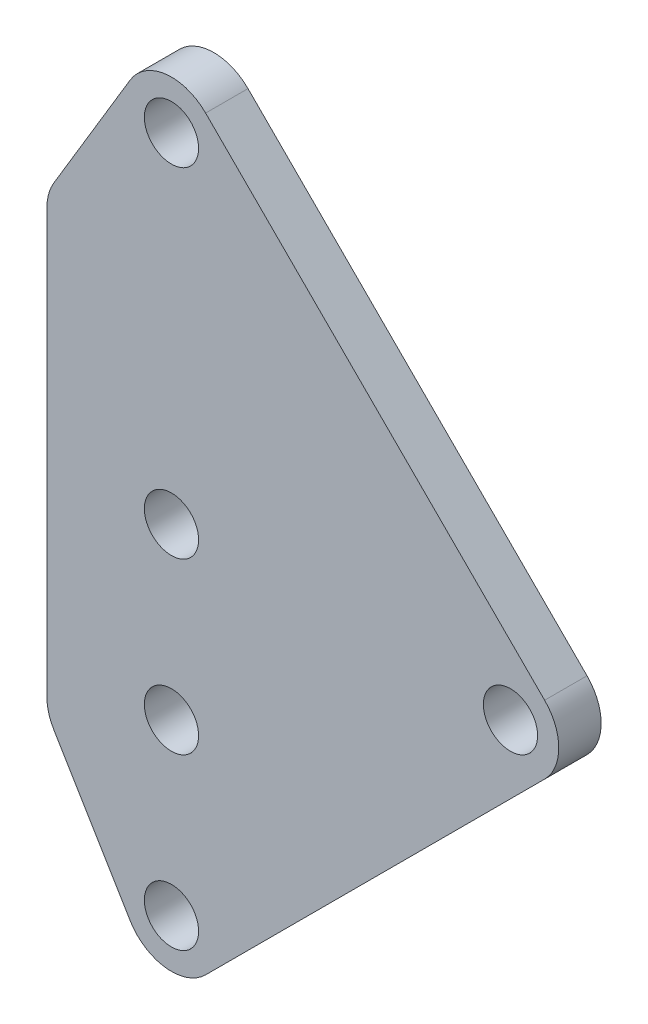
ISO-10303-21;
HEADER;
FILE_DESCRIPTION(('STEP AP214'),'2;1');
FILE_NAME('part.step','',(''),(''),'','','');
FILE_SCHEMA(('AUTOMOTIVE_DESIGN { 1 0 10303 214 1 1 1 1 }'));
ENDSEC;
DATA;
#1=APPLICATION_CONTEXT('core data for automotive mechanical design processes');
#2=APPLICATION_PROTOCOL_DEFINITION('international standard','automotive_design',2000,#1);
#3=PRODUCT_CONTEXT('',#1,'mechanical');
#4=PRODUCT('Part','Part','',(#3));
#5=PRODUCT_RELATED_PRODUCT_CATEGORY('part','',(#4));
#6=PRODUCT_DEFINITION_FORMATION('','',#4);
#7=PRODUCT_DEFINITION_CONTEXT('part definition',#1,'design');
#8=PRODUCT_DEFINITION('design','',#6,#7);
#9=PRODUCT_DEFINITION_SHAPE('','',#8);
#10=(LENGTH_UNIT() NAMED_UNIT(*) SI_UNIT(.MILLI.,.METRE.));
#11=(NAMED_UNIT(*) PLANE_ANGLE_UNIT() SI_UNIT($,.RADIAN.));
#12=(NAMED_UNIT(*) SI_UNIT($,.STERADIAN.) SOLID_ANGLE_UNIT());
#13=UNCERTAINTY_MEASURE_WITH_UNIT(LENGTH_MEASURE(1.E-05),#10,'distance_accuracy_value','');
#14=(GEOMETRIC_REPRESENTATION_CONTEXT(3) GLOBAL_UNCERTAINTY_ASSIGNED_CONTEXT((#13)) GLOBAL_UNIT_ASSIGNED_CONTEXT((#10,
#11,#12)) REPRESENTATION_CONTEXT('',''));
#15=CARTESIAN_POINT('',(0.,0.,0.));
#16=DIRECTION('',(0.,0.,1.));
#17=DIRECTION('',(1.,0.,0.));
#18=AXIS2_PLACEMENT_3D('',#15,#16,#17);
#19=CARTESIAN_POINT('',(0.,-25.4,3.175));
#20=DIRECTION('',(0.,0.,1.));
#21=DIRECTION('',(1.,0.,0.));
#22=AXIS2_PLACEMENT_3D('',#19,#20,#21);
#23=PLANE('',#22);
#24=CARTESIAN_POINT('',(25.4,0.,3.175));
#25=DIRECTION('',(0.,0.,1.));
#26=DIRECTION('',(1.,0.,0.));
#27=AXIS2_PLACEMENT_3D('',#24,#25,#26);
#28=CIRCLE('',#27,2.032);
#29=CARTESIAN_POINT('',(27.432,0.,3.175));
#30=VERTEX_POINT('',#29);
#31=EDGE_CURVE('E271',#30,#30,#28,.T.);
#32=ORIENTED_EDGE('',*,*,#31,.F.);
#33=EDGE_LOOP('',(#32));
#34=FACE_BOUND('',#33,.T.);
#35=CARTESIAN_POINT('',(0.,25.4,3.175));
#36=DIRECTION('',(0.,0.,1.));
#37=DIRECTION('',(1.,0.,0.));
#38=AXIS2_PLACEMENT_3D('',#35,#36,#37);
#39=CIRCLE('',#38,2.032);
#40=CARTESIAN_POINT('',(2.032,25.4,3.175));
#41=VERTEX_POINT('',#40);
#42=EDGE_CURVE('E255',#41,#41,#39,.T.);
#43=ORIENTED_EDGE('',*,*,#42,.F.);
#44=EDGE_LOOP('',(#43));
#45=FACE_BOUND('',#44,.T.);
#46=CARTESIAN_POINT('',(0.,-25.4,3.175));
#47=DIRECTION('',(0.,0.,1.));
#48=DIRECTION('',(1.,0.,0.));
#49=AXIS2_PLACEMENT_3D('',#46,#47,#48);
#50=CIRCLE('',#49,3.6195);
#51=CARTESIAN_POINT('',(-3.10419305845572,-27.2613881126287,3.175));
#52=VERTEX_POINT('',#51);
#53=CARTESIAN_POINT('',(2.55937299450471,-27.9593729945047,3.175));
#54=VERTEX_POINT('',#53);
#55=EDGE_CURVE('E188',#52,#54,#50,.T.);
#56=ORIENTED_EDGE('',*,*,#55,.T.);
#57=DIRECTION('',(0.707106781186547,0.707106781186547,0.));
#58=VECTOR('',#57,1.);
#59=CARTESIAN_POINT('',(2.55937299450471,-27.9593729945047,3.175));
#60=LINE('',#59,#58);
#61=CARTESIAN_POINT('',(27.9593729945047,-2.55937299450471,3.175));
#62=VERTEX_POINT('',#61);
#63=EDGE_CURVE('E112',#54,#62,#60,.T.);
#64=ORIENTED_EDGE('',*,*,#63,.T.);
#65=CARTESIAN_POINT('',(25.4,0.,3.175));
#66=DIRECTION('',(0.,0.,1.));
#67=DIRECTION('',(1.,0.,0.));
#68=AXIS2_PLACEMENT_3D('',#65,#66,#67);
#69=CIRCLE('',#68,3.6195);
#70=CARTESIAN_POINT('',(27.9593729945047,2.55937299450471,3.175));
#71=VERTEX_POINT('',#70);
#72=EDGE_CURVE('E217',#62,#71,#69,.T.);
#73=ORIENTED_EDGE('',*,*,#72,.T.);
#74=DIRECTION('',(-0.707106781186548,0.707106781186547,0.));
#75=VECTOR('',#74,1.);
#76=CARTESIAN_POINT('',(2.55937299450471,27.9593729945047,3.175));
#77=LINE('',#76,#75);
#78=CARTESIAN_POINT('',(2.55937299450471,27.9593729945047,3.175));
#79=VERTEX_POINT('',#78);
#80=EDGE_CURVE('E237',#71,#79,#77,.T.);
#81=ORIENTED_EDGE('',*,*,#80,.T.);
#82=CARTESIAN_POINT('',(0.,25.4,3.175));
#83=DIRECTION('',(0.,0.,1.));
#84=DIRECTION('',(1.,0.,0.));
#85=AXIS2_PLACEMENT_3D('',#82,#83,#84);
#86=CIRCLE('',#85,3.6195);
#87=CARTESIAN_POINT('',(-3.10419305845572,27.2613881126287,3.175));
#88=VERTEX_POINT('',#87);
#89=EDGE_CURVE('E233',#79,#88,#86,.T.);
#90=ORIENTED_EDGE('',*,*,#89,.T.);
#91=DIRECTION('',(-0.514266642527608,-0.857630351831943,0.));
#92=VECTOR('',#91,1.);
#93=CARTESIAN_POINT('',(-3.10419305845572,27.2613881126287,3.175));
#94=LINE('',#93,#92);
#95=CARTESIAN_POINT('',(-8.81573272074991,17.7363881126287,3.175));
#96=VERTEX_POINT('',#95);
#97=EDGE_CURVE('E236',#88,#96,#94,.T.);
#98=ORIENTED_EDGE('',*,*,#97,.T.);
#99=CARTESIAN_POINT('',(-5.71153966229419,15.875,3.175));
#100=DIRECTION('',(0.,0.,1.));
#101=DIRECTION('',(1.,0.,0.));
#102=AXIS2_PLACEMENT_3D('',#99,#100,#101);
#103=CIRCLE('',#102,3.6195);
#104=CARTESIAN_POINT('',(-9.33103966229419,15.875,3.175));
#105=VERTEX_POINT('',#104);
#106=EDGE_CURVE('E137',#96,#105,#103,.T.);
#107=ORIENTED_EDGE('',*,*,#106,.T.);
#108=DIRECTION('',(0.,-1.,0.));
#109=VECTOR('',#108,1.);
#110=CARTESIAN_POINT('',(-9.33103966229419,15.875,3.175));
#111=LINE('',#110,#109);
#112=CARTESIAN_POINT('',(-9.3310396622942,-15.875,3.175));
#113=VERTEX_POINT('',#112);
#114=EDGE_CURVE('E131',#105,#113,#111,.T.);
#115=ORIENTED_EDGE('',*,*,#114,.T.);
#116=CARTESIAN_POINT('',(-5.71153966229419,-15.875,3.175));
#117=DIRECTION('',(0.,0.,1.));
#118=DIRECTION('',(1.,0.,0.));
#119=AXIS2_PLACEMENT_3D('',#116,#117,#118);
#120=CIRCLE('',#119,3.6195);
#121=CARTESIAN_POINT('',(-8.81573272074991,-17.7363881126287,3.175));
#122=VERTEX_POINT('',#121);
#123=EDGE_CURVE('E135',#113,#122,#120,.T.);
#124=ORIENTED_EDGE('',*,*,#123,.T.);
#125=DIRECTION('',(0.514266642527608,-0.857630351831943,0.));
#126=VECTOR('',#125,1.);
#127=CARTESIAN_POINT('',(-3.10419305845572,-27.2613881126287,3.175));
#128=LINE('',#127,#126);
#129=EDGE_CURVE('E63',#122,#52,#128,.T.);
#130=ORIENTED_EDGE('',*,*,#129,.T.);
#131=EDGE_LOOP('',(#56,#64,#73,#81,#90,#98,#107,#115,#124,#130));
#132=FACE_BOUND('',#131,.T.);
#133=CARTESIAN_POINT('',(0.,0.,3.175));
#134=DIRECTION('',(0.,0.,1.));
#135=DIRECTION('',(1.,0.,0.));
#136=AXIS2_PLACEMENT_3D('',#133,#134,#135);
#137=CIRCLE('',#136,2.032);
#138=CARTESIAN_POINT('',(2.032,0.,3.175));
#139=VERTEX_POINT('',#138);
#140=EDGE_CURVE('E164',#139,#139,#137,.T.);
#141=ORIENTED_EDGE('',*,*,#140,.F.);
#142=EDGE_LOOP('',(#141));
#143=FACE_BOUND('',#142,.T.);
#144=CARTESIAN_POINT('',(0.,-25.4,3.175));
#145=DIRECTION('',(0.,0.,1.));
#146=DIRECTION('',(1.,0.,0.));
#147=AXIS2_PLACEMENT_3D('',#144,#145,#146);
#148=CIRCLE('',#147,2.032);
#149=CARTESIAN_POINT('',(2.032,-25.4,3.175));
#150=VERTEX_POINT('',#149);
#151=EDGE_CURVE('E263',#150,#150,#148,.T.);
#152=ORIENTED_EDGE('',*,*,#151,.F.);
#153=EDGE_LOOP('',(#152));
#154=FACE_BOUND('',#153,.T.);
#155=CARTESIAN_POINT('',(0.,-12.7,3.175));
#156=DIRECTION('',(0.,0.,1.));
#157=DIRECTION('',(1.,0.,0.));
#158=AXIS2_PLACEMENT_3D('',#155,#156,#157);
#159=CIRCLE('',#158,2.032);
#160=CARTESIAN_POINT('',(2.032,-12.7,3.175));
#161=VERTEX_POINT('',#160);
#162=EDGE_CURVE('E279',#161,#161,#159,.T.);
#163=ORIENTED_EDGE('',*,*,#162,.F.);
#164=EDGE_LOOP('',(#163));
#165=FACE_BOUND('',#164,.T.);
#166=ADVANCED_FACE('F45',(#34,#45,#132,#143,#154,#165),#23,.T.);
#167=CARTESIAN_POINT('',(0.,-25.4,0.));
#168=DIRECTION('',(0.,0.,1.));
#169=DIRECTION('',(1.,0.,0.));
#170=AXIS2_PLACEMENT_3D('',#167,#168,#169);
#171=PLANE('',#170);
#172=CARTESIAN_POINT('',(0.,-25.4,0.));
#173=DIRECTION('',(0.,0.,1.));
#174=DIRECTION('',(1.,0.,0.));
#175=AXIS2_PLACEMENT_3D('',#172,#173,#174);
#176=CIRCLE('',#175,3.6195);
#177=CARTESIAN_POINT('',(-3.10419305845572,-27.2613881126287,0.));
#178=VERTEX_POINT('',#177);
#179=CARTESIAN_POINT('',(2.55937299450471,-27.9593729945047,0.));
#180=VERTEX_POINT('',#179);
#181=EDGE_CURVE('E159',#178,#180,#176,.T.);
#182=ORIENTED_EDGE('',*,*,#181,.F.);
#183=DIRECTION('',(0.514266642527608,-0.857630351831943,0.));
#184=VECTOR('',#183,1.);
#185=CARTESIAN_POINT('',(-3.10419305845572,-27.2613881126287,0.));
#186=LINE('',#185,#184);
#187=CARTESIAN_POINT('',(-8.81573272074991,-17.7363881126287,0.));
#188=VERTEX_POINT('',#187);
#189=EDGE_CURVE('E104',#188,#178,#186,.T.);
#190=ORIENTED_EDGE('',*,*,#189,.F.);
#191=CARTESIAN_POINT('',(-5.71153966229419,-15.875,0.));
#192=DIRECTION('',(0.,0.,1.));
#193=DIRECTION('',(1.,0.,0.));
#194=AXIS2_PLACEMENT_3D('',#191,#192,#193);
#195=CIRCLE('',#194,3.6195);
#196=CARTESIAN_POINT('',(-9.3310396622942,-15.875,0.));
#197=VERTEX_POINT('',#196);
#198=EDGE_CURVE('E98',#197,#188,#195,.T.);
#199=ORIENTED_EDGE('',*,*,#198,.F.);
#200=DIRECTION('',(0.,-1.,0.));
#201=VECTOR('',#200,1.);
#202=CARTESIAN_POINT('',(-9.33103966229419,15.875,0.));
#203=LINE('',#202,#201);
#204=CARTESIAN_POINT('',(-9.33103966229419,15.875,0.));
#205=VERTEX_POINT('',#204);
#206=EDGE_CURVE('E146',#205,#197,#203,.T.);
#207=ORIENTED_EDGE('',*,*,#206,.F.);
#208=CARTESIAN_POINT('',(-5.71153966229419,15.875,0.));
#209=DIRECTION('',(0.,0.,1.));
#210=DIRECTION('',(1.,0.,0.));
#211=AXIS2_PLACEMENT_3D('',#208,#209,#210);
#212=CIRCLE('',#211,3.6195);
#213=CARTESIAN_POINT('',(-8.81573272074991,17.7363881126287,0.));
#214=VERTEX_POINT('',#213);
#215=EDGE_CURVE('E179',#214,#205,#212,.T.);
#216=ORIENTED_EDGE('',*,*,#215,.F.);
#217=DIRECTION('',(-0.514266642527608,-0.857630351831943,0.));
#218=VECTOR('',#217,1.);
#219=CARTESIAN_POINT('',(-3.10419305845572,27.2613881126287,0.));
#220=LINE('',#219,#218);
#221=CARTESIAN_POINT('',(-3.10419305845572,27.2613881126287,0.));
#222=VERTEX_POINT('',#221);
#223=EDGE_CURVE('E176',#222,#214,#220,.T.);
#224=ORIENTED_EDGE('',*,*,#223,.F.);
#225=CARTESIAN_POINT('',(0.,25.4,0.));
#226=DIRECTION('',(0.,0.,1.));
#227=DIRECTION('',(1.,0.,0.));
#228=AXIS2_PLACEMENT_3D('',#225,#226,#227);
#229=CIRCLE('',#228,3.6195);
#230=CARTESIAN_POINT('',(2.55937299450471,27.9593729945047,0.));
#231=VERTEX_POINT('',#230);
#232=EDGE_CURVE('E173',#231,#222,#229,.T.);
#233=ORIENTED_EDGE('',*,*,#232,.F.);
#234=DIRECTION('',(-0.707106781186548,0.707106781186547,0.));
#235=VECTOR('',#234,1.);
#236=CARTESIAN_POINT('',(2.55937299450471,27.9593729945047,0.));
#237=LINE('',#236,#235);
#238=CARTESIAN_POINT('',(27.9593729945047,2.55937299450471,0.));
#239=VERTEX_POINT('',#238);
#240=EDGE_CURVE('E170',#239,#231,#237,.T.);
#241=ORIENTED_EDGE('',*,*,#240,.F.);
#242=CARTESIAN_POINT('',(25.4,0.,0.));
#243=DIRECTION('',(0.,0.,1.));
#244=DIRECTION('',(1.,0.,0.));
#245=AXIS2_PLACEMENT_3D('',#242,#243,#244);
#246=CIRCLE('',#245,3.6195);
#247=CARTESIAN_POINT('',(27.9593729945047,-2.55937299450471,0.));
#248=VERTEX_POINT('',#247);
#249=EDGE_CURVE('E167',#248,#239,#246,.T.);
#250=ORIENTED_EDGE('',*,*,#249,.F.);
#251=DIRECTION('',(0.707106781186547,0.707106781186547,0.));
#252=VECTOR('',#251,1.);
#253=CARTESIAN_POINT('',(2.55937299450471,-27.9593729945047,0.));
#254=LINE('',#253,#252);
#255=EDGE_CURVE('E163',#180,#248,#254,.T.);
#256=ORIENTED_EDGE('',*,*,#255,.F.);
#257=EDGE_LOOP('',(#182,#190,#199,#207,#216,#224,#233,#241,#250,#256));
#258=FACE_BOUND('',#257,.T.);
#259=CARTESIAN_POINT('',(0.,0.,0.));
#260=DIRECTION('',(0.,0.,1.));
#261=DIRECTION('',(1.,0.,0.));
#262=AXIS2_PLACEMENT_3D('',#259,#260,#261);
#263=CIRCLE('',#262,2.032);
#264=CARTESIAN_POINT('',(2.032,0.,0.));
#265=VERTEX_POINT('',#264);
#266=EDGE_CURVE('E251',#265,#265,#263,.T.);
#267=ORIENTED_EDGE('',*,*,#266,.T.);
#268=EDGE_LOOP('',(#267));
#269=FACE_BOUND('',#268,.T.);
#270=CARTESIAN_POINT('',(0.,25.4,0.));
#271=DIRECTION('',(0.,0.,1.));
#272=DIRECTION('',(1.,0.,0.));
#273=AXIS2_PLACEMENT_3D('',#270,#271,#272);
#274=CIRCLE('',#273,2.032);
#275=CARTESIAN_POINT('',(2.032,25.4,0.));
#276=VERTEX_POINT('',#275);
#277=EDGE_CURVE('E259',#276,#276,#274,.T.);
#278=ORIENTED_EDGE('',*,*,#277,.T.);
#279=EDGE_LOOP('',(#278));
#280=FACE_BOUND('',#279,.T.);
#281=CARTESIAN_POINT('',(0.,-25.4,0.));
#282=DIRECTION('',(0.,0.,1.));
#283=DIRECTION('',(1.,0.,0.));
#284=AXIS2_PLACEMENT_3D('',#281,#282,#283);
#285=CIRCLE('',#284,2.032);
#286=CARTESIAN_POINT('',(2.032,-25.4,0.));
#287=VERTEX_POINT('',#286);
#288=EDGE_CURVE('E267',#287,#287,#285,.T.);
#289=ORIENTED_EDGE('',*,*,#288,.T.);
#290=EDGE_LOOP('',(#289));
#291=FACE_BOUND('',#290,.T.);
#292=CARTESIAN_POINT('',(25.4,0.,0.));
#293=DIRECTION('',(0.,0.,1.));
#294=DIRECTION('',(1.,0.,0.));
#295=AXIS2_PLACEMENT_3D('',#292,#293,#294);
#296=CIRCLE('',#295,2.032);
#297=CARTESIAN_POINT('',(27.432,0.,0.));
#298=VERTEX_POINT('',#297);
#299=EDGE_CURVE('E275',#298,#298,#296,.T.);
#300=ORIENTED_EDGE('',*,*,#299,.T.);
#301=EDGE_LOOP('',(#300));
#302=FACE_BOUND('',#301,.T.);
#303=CARTESIAN_POINT('',(0.,-12.7,0.));
#304=DIRECTION('',(0.,0.,1.));
#305=DIRECTION('',(1.,0.,0.));
#306=AXIS2_PLACEMENT_3D('',#303,#304,#305);
#307=CIRCLE('',#306,2.032);
#308=CARTESIAN_POINT('',(2.032,-12.7,0.));
#309=VERTEX_POINT('',#308);
#310=EDGE_CURVE('E283',#309,#309,#307,.T.);
#311=ORIENTED_EDGE('',*,*,#310,.T.);
#312=EDGE_LOOP('',(#311));
#313=FACE_BOUND('',#312,.T.);
#314=ADVANCED_FACE('F221',(#258,#269,#280,#291,#302,#313),#171,.F.);
#315=CARTESIAN_POINT('',(0.,-25.4,3.175));
#316=DIRECTION('',(0.,0.,-1.));
#317=DIRECTION('',(-1.,0.,0.));
#318=AXIS2_PLACEMENT_3D('',#315,#316,#317);
#319=CYLINDRICAL_SURFACE('',#318,3.6195);
#320=ORIENTED_EDGE('',*,*,#181,.T.);
#321=DIRECTION('',(0.,0.,-1.));
#322=VECTOR('',#321,1.);
#323=CARTESIAN_POINT('',(2.55937299450471,-27.9593729945047,3.175));
#324=LINE('',#323,#322);
#325=EDGE_CURVE('E11',#54,#180,#324,.T.);
#326=ORIENTED_EDGE('',*,*,#325,.F.);
#327=ORIENTED_EDGE('',*,*,#55,.F.);
#328=DIRECTION('',(0.,0.,-1.));
#329=VECTOR('',#328,1.);
#330=CARTESIAN_POINT('',(-3.10419305845572,-27.2613881126287,3.175));
#331=LINE('',#330,#329);
#332=EDGE_CURVE('E155',#52,#178,#331,.T.);
#333=ORIENTED_EDGE('',*,*,#332,.T.);
#334=EDGE_LOOP('',(#320,#326,#327,#333));
#335=FACE_BOUND('',#334,.T.);
#336=ADVANCED_FACE('F47',(#335),#319,.T.);
#337=CARTESIAN_POINT('',(2.55937299450471,-27.9593729945047,3.175));
#338=DIRECTION('',(-0.707106781186548,0.707106781186548,0.));
#339=DIRECTION('',(-0.707106781186548,-0.707106781186548,0.));
#340=AXIS2_PLACEMENT_3D('',#337,#338,#339);
#341=PLANE('',#340);
#342=ORIENTED_EDGE('',*,*,#255,.T.);
#343=DIRECTION('',(0.,0.,-1.));
#344=VECTOR('',#343,1.);
#345=CARTESIAN_POINT('',(27.9593729945047,-2.55937299450471,3.175));
#346=LINE('',#345,#344);
#347=EDGE_CURVE('E55',#62,#248,#346,.T.);
#348=ORIENTED_EDGE('',*,*,#347,.F.);
#349=ORIENTED_EDGE('',*,*,#63,.F.);
#350=ORIENTED_EDGE('',*,*,#325,.T.);
#351=EDGE_LOOP('',(#342,#348,#349,#350));
#352=FACE_BOUND('',#351,.T.);
#353=ADVANCED_FACE('F327',(#352),#341,.F.);
#354=CARTESIAN_POINT('',(25.4,0.,3.175));
#355=DIRECTION('',(0.,0.,-1.));
#356=DIRECTION('',(-1.,0.,0.));
#357=AXIS2_PLACEMENT_3D('',#354,#355,#356);
#358=CYLINDRICAL_SURFACE('',#357,3.6195);
#359=ORIENTED_EDGE('',*,*,#249,.T.);
#360=DIRECTION('',(0.,0.,-1.));
#361=VECTOR('',#360,1.);
#362=CARTESIAN_POINT('',(27.9593729945047,2.55937299450471,3.175));
#363=LINE('',#362,#361);
#364=EDGE_CURVE('E207',#71,#239,#363,.T.);
#365=ORIENTED_EDGE('',*,*,#364,.F.);
#366=ORIENTED_EDGE('',*,*,#72,.F.);
#367=ORIENTED_EDGE('',*,*,#347,.T.);
#368=EDGE_LOOP('',(#359,#365,#366,#367));
#369=FACE_BOUND('',#368,.T.);
#370=ADVANCED_FACE('F215',(#369),#358,.T.);
#371=CARTESIAN_POINT('',(2.55937299450471,27.9593729945047,3.175));
#372=DIRECTION('',(-0.707106781186547,-0.707106781186548,0.));
#373=DIRECTION('',(0.707106781186548,-0.707106781186547,0.));
#374=AXIS2_PLACEMENT_3D('',#371,#372,#373);
#375=PLANE('',#374);
#376=ORIENTED_EDGE('',*,*,#240,.T.);
#377=DIRECTION('',(0.,0.,-1.));
#378=VECTOR('',#377,1.);
#379=CARTESIAN_POINT('',(2.55937299450471,27.9593729945047,3.175));
#380=LINE('',#379,#378);
#381=EDGE_CURVE('E203',#79,#231,#380,.T.);
#382=ORIENTED_EDGE('',*,*,#381,.F.);
#383=ORIENTED_EDGE('',*,*,#80,.F.);
#384=ORIENTED_EDGE('',*,*,#364,.T.);
#385=EDGE_LOOP('',(#376,#382,#383,#384));
#386=FACE_BOUND('',#385,.T.);
#387=ADVANCED_FACE('F227',(#386),#375,.F.);
#388=CARTESIAN_POINT('',(0.,25.4,3.175));
#389=DIRECTION('',(0.,0.,-1.));
#390=DIRECTION('',(-1.,0.,0.));
#391=AXIS2_PLACEMENT_3D('',#388,#389,#390);
#392=CYLINDRICAL_SURFACE('',#391,3.6195);
#393=ORIENTED_EDGE('',*,*,#232,.T.);
#394=DIRECTION('',(0.,0.,-1.));
#395=VECTOR('',#394,1.);
#396=CARTESIAN_POINT('',(-3.10419305845572,27.2613881126287,3.175));
#397=LINE('',#396,#395);
#398=EDGE_CURVE('E199',#88,#222,#397,.T.);
#399=ORIENTED_EDGE('',*,*,#398,.F.);
#400=ORIENTED_EDGE('',*,*,#89,.F.);
#401=ORIENTED_EDGE('',*,*,#381,.T.);
#402=EDGE_LOOP('',(#393,#399,#400,#401));
#403=FACE_BOUND('',#402,.T.);
#404=ADVANCED_FACE('F231',(#403),#392,.T.);
#405=CARTESIAN_POINT('',(-3.10419305845572,27.2613881126287,3.175));
#406=DIRECTION('',(0.857630351831942,-0.514266642527608,0.));
#407=DIRECTION('',(0.514266642527608,0.857630351831943,0.));
#408=AXIS2_PLACEMENT_3D('',#405,#406,#407);
#409=PLANE('',#408);
#410=ORIENTED_EDGE('',*,*,#223,.T.);
#411=DIRECTION('',(0.,0.,-1.));
#412=VECTOR('',#411,1.);
#413=CARTESIAN_POINT('',(-8.81573272074991,17.7363881126287,3.175));
#414=LINE('',#413,#412);
#415=EDGE_CURVE('E195',#96,#214,#414,.T.);
#416=ORIENTED_EDGE('',*,*,#415,.F.);
#417=ORIENTED_EDGE('',*,*,#97,.F.);
#418=ORIENTED_EDGE('',*,*,#398,.T.);
#419=EDGE_LOOP('',(#410,#416,#417,#418));
#420=FACE_BOUND('',#419,.T.);
#421=ADVANCED_FACE('F317',(#420),#409,.F.);
#422=CARTESIAN_POINT('',(-5.71153966229419,15.875,3.175));
#423=DIRECTION('',(0.,0.,-1.));
#424=DIRECTION('',(-1.,0.,0.));
#425=AXIS2_PLACEMENT_3D('',#422,#423,#424);
#426=CYLINDRICAL_SURFACE('',#425,3.6195);
#427=ORIENTED_EDGE('',*,*,#215,.T.);
#428=DIRECTION('',(0.,0.,-1.));
#429=VECTOR('',#428,1.);
#430=CARTESIAN_POINT('',(-9.33103966229419,15.875,3.175));
#431=LINE('',#430,#429);
#432=EDGE_CURVE('E148',#105,#205,#431,.T.);
#433=ORIENTED_EDGE('',*,*,#432,.F.);
#434=ORIENTED_EDGE('',*,*,#106,.F.);
#435=ORIENTED_EDGE('',*,*,#415,.T.);
#436=EDGE_LOOP('',(#427,#433,#434,#435));
#437=FACE_BOUND('',#436,.T.);
#438=ADVANCED_FACE('F314',(#437),#426,.T.);
#439=CARTESIAN_POINT('',(-9.33103966229419,15.875,3.175));
#440=DIRECTION('',(1.,0.,0.));
#441=DIRECTION('',(0.,1.,0.));
#442=AXIS2_PLACEMENT_3D('',#439,#440,#441);
#443=PLANE('',#442);
#444=ORIENTED_EDGE('',*,*,#206,.T.);
#445=DIRECTION('',(0.,0.,-1.));
#446=VECTOR('',#445,1.);
#447=CARTESIAN_POINT('',(-9.3310396622942,-15.875,3.175));
#448=LINE('',#447,#446);
#449=EDGE_CURVE('E143',#113,#197,#448,.T.);
#450=ORIENTED_EDGE('',*,*,#449,.F.);
#451=ORIENTED_EDGE('',*,*,#114,.F.);
#452=ORIENTED_EDGE('',*,*,#432,.T.);
#453=EDGE_LOOP('',(#444,#450,#451,#452));
#454=FACE_BOUND('',#453,.T.);
#455=ADVANCED_FACE('F144',(#454),#443,.F.);
#456=CARTESIAN_POINT('',(-5.71153966229419,-15.875,3.175));
#457=DIRECTION('',(0.,0.,-1.));
#458=DIRECTION('',(-1.,0.,0.));
#459=AXIS2_PLACEMENT_3D('',#456,#457,#458);
#460=CYLINDRICAL_SURFACE('',#459,3.6195);
#461=ORIENTED_EDGE('',*,*,#198,.T.);
#462=DIRECTION('',(0.,0.,-1.));
#463=VECTOR('',#462,1.);
#464=CARTESIAN_POINT('',(-8.81573272074991,-17.7363881126287,3.175));
#465=LINE('',#464,#463);
#466=EDGE_CURVE('E149',#122,#188,#465,.T.);
#467=ORIENTED_EDGE('',*,*,#466,.F.);
#468=ORIENTED_EDGE('',*,*,#123,.F.);
#469=ORIENTED_EDGE('',*,*,#449,.T.);
#470=EDGE_LOOP('',(#461,#467,#468,#469));
#471=FACE_BOUND('',#470,.T.);
#472=ADVANCED_FACE('F151',(#471),#460,.T.);
#473=CARTESIAN_POINT('',(-3.10419305845572,-27.2613881126287,3.175));
#474=DIRECTION('',(0.857630351831943,0.514266642527608,0.));
#475=DIRECTION('',(-0.514266642527608,0.857630351831943,0.));
#476=AXIS2_PLACEMENT_3D('',#473,#474,#475);
#477=PLANE('',#476);
#478=ORIENTED_EDGE('',*,*,#189,.T.);
#479=ORIENTED_EDGE('',*,*,#332,.F.);
#480=ORIENTED_EDGE('',*,*,#129,.F.);
#481=ORIENTED_EDGE('',*,*,#466,.T.);
#482=EDGE_LOOP('',(#478,#479,#480,#481));
#483=FACE_BOUND('',#482,.T.);
#484=ADVANCED_FACE('F307',(#483),#477,.F.);
#485=CARTESIAN_POINT('',(0.,0.,3.175));
#486=DIRECTION('',(0.,0.,-1.));
#487=DIRECTION('',(-1.,0.,0.));
#488=AXIS2_PLACEMENT_3D('',#485,#486,#487);
#489=CYLINDRICAL_SURFACE('',#488,2.032);
#490=ORIENTED_EDGE('',*,*,#140,.T.);
#491=EDGE_LOOP('',(#490));
#492=FACE_BOUND('',#491,.T.);
#493=ORIENTED_EDGE('',*,*,#266,.F.);
#494=EDGE_LOOP('',(#493));
#495=FACE_BOUND('',#494,.T.);
#496=ADVANCED_FACE('F304',(#492,#495),#489,.F.);
#497=CARTESIAN_POINT('',(0.,25.4,3.175));
#498=DIRECTION('',(0.,0.,-1.));
#499=DIRECTION('',(-1.,0.,0.));
#500=AXIS2_PLACEMENT_3D('',#497,#498,#499);
#501=CYLINDRICAL_SURFACE('',#500,2.032);
#502=ORIENTED_EDGE('',*,*,#42,.T.);
#503=EDGE_LOOP('',(#502));
#504=FACE_BOUND('',#503,.T.);
#505=ORIENTED_EDGE('',*,*,#277,.F.);
#506=EDGE_LOOP('',(#505));
#507=FACE_BOUND('',#506,.T.);
#508=ADVANCED_FACE('F402',(#504,#507),#501,.F.);
#509=CARTESIAN_POINT('',(0.,-25.4,3.175));
#510=DIRECTION('',(0.,0.,-1.));
#511=DIRECTION('',(-1.,0.,0.));
#512=AXIS2_PLACEMENT_3D('',#509,#510,#511);
#513=CYLINDRICAL_SURFACE('',#512,2.032);
#514=ORIENTED_EDGE('',*,*,#151,.T.);
#515=EDGE_LOOP('',(#514));
#516=FACE_BOUND('',#515,.T.);
#517=ORIENTED_EDGE('',*,*,#288,.F.);
#518=EDGE_LOOP('',(#517));
#519=FACE_BOUND('',#518,.T.);
#520=ADVANCED_FACE('F410',(#516,#519),#513,.F.);
#521=CARTESIAN_POINT('',(25.4,0.,3.175));
#522=DIRECTION('',(0.,0.,-1.));
#523=DIRECTION('',(-1.,0.,0.));
#524=AXIS2_PLACEMENT_3D('',#521,#522,#523);
#525=CYLINDRICAL_SURFACE('',#524,2.032);
#526=ORIENTED_EDGE('',*,*,#31,.T.);
#527=EDGE_LOOP('',(#526));
#528=FACE_BOUND('',#527,.T.);
#529=ORIENTED_EDGE('',*,*,#299,.F.);
#530=EDGE_LOOP('',(#529));
#531=FACE_BOUND('',#530,.T.);
#532=ADVANCED_FACE('F418',(#528,#531),#525,.F.);
#533=CARTESIAN_POINT('',(0.,-12.7,3.175));
#534=DIRECTION('',(0.,0.,-1.));
#535=DIRECTION('',(-1.,0.,0.));
#536=AXIS2_PLACEMENT_3D('',#533,#534,#535);
#537=CYLINDRICAL_SURFACE('',#536,2.032);
#538=ORIENTED_EDGE('',*,*,#162,.T.);
#539=EDGE_LOOP('',(#538));
#540=FACE_BOUND('',#539,.T.);
#541=ORIENTED_EDGE('',*,*,#310,.F.);
#542=EDGE_LOOP('',(#541));
#543=FACE_BOUND('',#542,.T.);
#544=ADVANCED_FACE('F291',(#540,#543),#537,.F.);
#545=CLOSED_SHELL('',(#166,#314,#336,#353,#370,#387,#404,#421,#438,#455,#472,#484,#496,#508,
#520,#532,#544));
#546=MANIFOLD_SOLID_BREP('B2',#545);
#547=ADVANCED_BREP_SHAPE_REPRESENTATION('',(#18,#546),#14);
#548=SHAPE_DEFINITION_REPRESENTATION(#9,#547);
ENDSEC;
END-ISO-10303-21;
